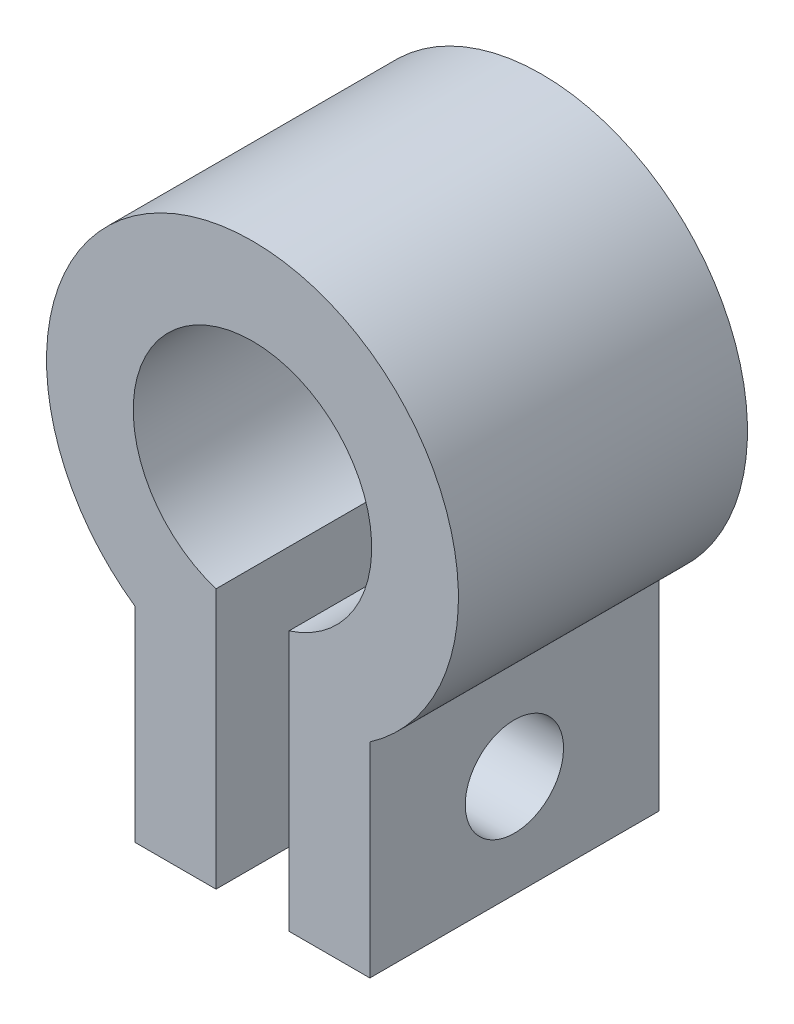
ISO-10303-21;
HEADER;
FILE_DESCRIPTION(('STEP AP214'),'2;1');
FILE_NAME('part.step','',(''),(''),'','','');
FILE_SCHEMA(('AUTOMOTIVE_DESIGN { 1 0 10303 214 1 1 1 1 }'));
ENDSEC;
DATA;
#1=APPLICATION_CONTEXT('core data for automotive mechanical design processes');
#2=APPLICATION_PROTOCOL_DEFINITION('international standard','automotive_design',2000,#1);
#3=PRODUCT_CONTEXT('',#1,'mechanical');
#4=PRODUCT('Part','Part','',(#3));
#5=PRODUCT_RELATED_PRODUCT_CATEGORY('part','',(#4));
#6=PRODUCT_DEFINITION_FORMATION('','',#4);
#7=PRODUCT_DEFINITION_CONTEXT('part definition',#1,'design');
#8=PRODUCT_DEFINITION('design','',#6,#7);
#9=PRODUCT_DEFINITION_SHAPE('','',#8);
#10=(LENGTH_UNIT() NAMED_UNIT(*) SI_UNIT(.MILLI.,.METRE.));
#11=(NAMED_UNIT(*) PLANE_ANGLE_UNIT() SI_UNIT($,.RADIAN.));
#12=(NAMED_UNIT(*) SI_UNIT($,.STERADIAN.) SOLID_ANGLE_UNIT());
#13=UNCERTAINTY_MEASURE_WITH_UNIT(LENGTH_MEASURE(1.E-05),#10,'distance_accuracy_value','');
#14=(GEOMETRIC_REPRESENTATION_CONTEXT(3) GLOBAL_UNCERTAINTY_ASSIGNED_CONTEXT((#13)) GLOBAL_UNIT_ASSIGNED_CONTEXT((#10,
#11,#12)) REPRESENTATION_CONTEXT('',''));
#15=CARTESIAN_POINT('',(0.,0.,0.));
#16=DIRECTION('',(0.,0.,1.));
#17=DIRECTION('',(1.,0.,0.));
#18=AXIS2_PLACEMENT_3D('',#15,#16,#17);
#19=CARTESIAN_POINT('',(1.26124537025839,0.,10.));
#20=DIRECTION('',(1.,0.,0.));
#21=DIRECTION('',(0.,1.,0.));
#22=AXIS2_PLACEMENT_3D('',#19,#20,#21);
#23=PLANE('',#22);
#24=CARTESIAN_POINT('',(1.26124537025839,-9.3908371971767,5.));
#25=DIRECTION('',(1.,0.,0.));
#26=DIRECTION('',(0.,1.,0.));
#27=AXIS2_PLACEMENT_3D('',#24,#25,#26);
#28=CIRCLE('',#27,1.7);
#29=CARTESIAN_POINT('',(1.26124537025839,-7.6908371971767,5.));
#30=VERTEX_POINT('',#29);
#31=EDGE_CURVE('E135',#30,#30,#28,.T.);
#32=ORIENTED_EDGE('',*,*,#31,.T.);
#33=EDGE_LOOP('',(#32));
#34=FACE_BOUND('',#33,.T.);
#35=DIRECTION('',(0.,-1.,0.));
#36=VECTOR('',#35,1.);
#37=CARTESIAN_POINT('',(1.26124537025839,0.,0.));
#38=LINE('',#37,#36);
#39=CARTESIAN_POINT('',(1.26124537025839,-3.92745275159381,0.));
#40=VERTEX_POINT('',#39);
#41=CARTESIAN_POINT('',(1.26124537025839,-12.9274527515938,0.));
#42=VERTEX_POINT('',#41);
#43=EDGE_CURVE('E132',#40,#42,#38,.T.);
#44=ORIENTED_EDGE('',*,*,#43,.T.);
#45=DIRECTION('',(0.,0.,-1.));
#46=VECTOR('',#45,1.);
#47=CARTESIAN_POINT('',(1.26124537025839,-12.9274527515938,10.));
#48=LINE('',#47,#46);
#49=CARTESIAN_POINT('',(1.26124537025839,-12.9274527515938,10.));
#50=VERTEX_POINT('',#49);
#51=EDGE_CURVE('E11',#50,#42,#48,.T.);
#52=ORIENTED_EDGE('',*,*,#51,.F.);
#53=DIRECTION('',(0.,-1.,0.));
#54=VECTOR('',#53,1.);
#55=CARTESIAN_POINT('',(1.26124537025839,0.,10.));
#56=LINE('',#55,#54);
#57=CARTESIAN_POINT('',(1.26124537025839,-3.92745275159381,10.));
#58=VERTEX_POINT('',#57);
#59=EDGE_CURVE('E152',#58,#50,#56,.T.);
#60=ORIENTED_EDGE('',*,*,#59,.F.);
#61=DIRECTION('',(0.,0.,-1.));
#62=VECTOR('',#61,1.);
#63=CARTESIAN_POINT('',(1.26124537025839,-3.92745275159381,10.));
#64=LINE('',#63,#62);
#65=EDGE_CURVE('E52',#58,#40,#64,.T.);
#66=ORIENTED_EDGE('',*,*,#65,.T.);
#67=EDGE_LOOP('',(#44,#52,#60,#66));
#68=FACE_BOUND('',#67,.T.);
#69=ADVANCED_FACE('F35',(#34,#68),#23,.F.);
#70=CARTESIAN_POINT('',(0.,-12.9274527515938,10.));
#71=DIRECTION('',(0.,1.,0.));
#72=DIRECTION('',(0.,0.,1.));
#73=AXIS2_PLACEMENT_3D('',#70,#71,#72);
#74=PLANE('',#73);
#75=DIRECTION('',(1.,0.,0.));
#76=VECTOR('',#75,1.);
#77=CARTESIAN_POINT('',(0.,-12.9274527515938,0.));
#78=LINE('',#77,#76);
#79=CARTESIAN_POINT('',(4.06124537025839,-12.9274527515938,0.));
#80=VERTEX_POINT('',#79);
#81=EDGE_CURVE('E134',#42,#80,#78,.T.);
#82=ORIENTED_EDGE('',*,*,#81,.T.);
#83=DIRECTION('',(0.,0.,-1.));
#84=VECTOR('',#83,1.);
#85=CARTESIAN_POINT('',(4.06124537025839,-12.9274527515938,10.));
#86=LINE('',#85,#84);
#87=CARTESIAN_POINT('',(4.06124537025839,-12.9274527515938,10.));
#88=VERTEX_POINT('',#87);
#89=EDGE_CURVE('E44',#88,#80,#86,.T.);
#90=ORIENTED_EDGE('',*,*,#89,.F.);
#91=DIRECTION('',(1.,0.,0.));
#92=VECTOR('',#91,1.);
#93=CARTESIAN_POINT('',(0.,-12.9274527515938,10.));
#94=LINE('',#93,#92);
#95=EDGE_CURVE('E90',#50,#88,#94,.T.);
#96=ORIENTED_EDGE('',*,*,#95,.F.);
#97=ORIENTED_EDGE('',*,*,#51,.T.);
#98=EDGE_LOOP('',(#82,#90,#96,#97));
#99=FACE_BOUND('',#98,.T.);
#100=ADVANCED_FACE('F167',(#99),#74,.F.);
#101=CARTESIAN_POINT('',(4.06124537025839,0.,10.));
#102=DIRECTION('',(1.,0.,0.));
#103=DIRECTION('',(0.,1.,0.));
#104=AXIS2_PLACEMENT_3D('',#101,#102,#103);
#105=PLANE('',#104);
#106=CARTESIAN_POINT('',(4.06124537025839,-9.3908371971767,5.));
#107=DIRECTION('',(1.,0.,0.));
#108=DIRECTION('',(0.,1.,0.));
#109=AXIS2_PLACEMENT_3D('',#106,#107,#108);
#110=CIRCLE('',#109,1.7);
#111=CARTESIAN_POINT('',(4.06124537025839,-7.6908371971767,5.));
#112=VERTEX_POINT('',#111);
#113=EDGE_CURVE('E187',#112,#112,#110,.T.);
#114=ORIENTED_EDGE('',*,*,#113,.F.);
#115=EDGE_LOOP('',(#114));
#116=FACE_BOUND('',#115,.T.);
#117=DIRECTION('',(0.,-1.,0.));
#118=VECTOR('',#117,1.);
#119=CARTESIAN_POINT('',(4.06124537025839,0.,0.));
#120=LINE('',#119,#118);
#121=CARTESIAN_POINT('',(4.06124537025839,-5.85422164275959,0.));
#122=VERTEX_POINT('',#121);
#123=EDGE_CURVE('E138',#122,#80,#120,.T.);
#124=ORIENTED_EDGE('',*,*,#123,.F.);
#125=DIRECTION('',(0.,0.,-1.));
#126=VECTOR('',#125,1.);
#127=CARTESIAN_POINT('',(4.06124537025839,-5.85422164275959,10.));
#128=LINE('',#127,#126);
#129=CARTESIAN_POINT('',(4.06124537025839,-5.85422164275959,10.));
#130=VERTEX_POINT('',#129);
#131=EDGE_CURVE('E159',#130,#122,#128,.T.);
#132=ORIENTED_EDGE('',*,*,#131,.F.);
#133=DIRECTION('',(0.,-1.,0.));
#134=VECTOR('',#133,1.);
#135=CARTESIAN_POINT('',(4.06124537025839,0.,10.));
#136=LINE('',#135,#134);
#137=EDGE_CURVE('E166',#130,#88,#136,.T.);
#138=ORIENTED_EDGE('',*,*,#137,.T.);
#139=ORIENTED_EDGE('',*,*,#89,.T.);
#140=EDGE_LOOP('',(#124,#132,#138,#139));
#141=FACE_BOUND('',#140,.T.);
#142=ADVANCED_FACE('F164',(#116,#141),#105,.T.);
#143=CARTESIAN_POINT('',(0.,0.,10.));
#144=DIRECTION('',(0.,0.,-1.));
#145=DIRECTION('',(-1.,0.,0.));
#146=AXIS2_PLACEMENT_3D('',#143,#144,#145);
#147=CYLINDRICAL_SURFACE('',#146,7.125);
#148=CARTESIAN_POINT('',(0.,0.,0.));
#149=DIRECTION('',(0.,0.,1.));
#150=DIRECTION('',(1.,0.,0.));
#151=AXIS2_PLACEMENT_3D('',#148,#149,#150);
#152=CIRCLE('',#151,7.125);
#153=CARTESIAN_POINT('',(-4.06124537025839,-5.85422164275959,0.));
#154=VERTEX_POINT('',#153);
#155=EDGE_CURVE('E141',#122,#154,#152,.T.);
#156=ORIENTED_EDGE('',*,*,#155,.T.);
#157=DIRECTION('',(0.,0.,-1.));
#158=VECTOR('',#157,1.);
#159=CARTESIAN_POINT('',(-4.06124537025839,-5.85422164275959,10.));
#160=LINE('',#159,#158);
#161=CARTESIAN_POINT('',(-4.06124537025839,-5.85422164275959,10.));
#162=VERTEX_POINT('',#161);
#163=EDGE_CURVE('E156',#162,#154,#160,.T.);
#164=ORIENTED_EDGE('',*,*,#163,.F.);
#165=CARTESIAN_POINT('',(0.,0.,10.));
#166=DIRECTION('',(0.,0.,1.));
#167=DIRECTION('',(1.,0.,0.));
#168=AXIS2_PLACEMENT_3D('',#165,#166,#167);
#169=CIRCLE('',#168,7.125);
#170=EDGE_CURVE('E179',#130,#162,#169,.T.);
#171=ORIENTED_EDGE('',*,*,#170,.F.);
#172=ORIENTED_EDGE('',*,*,#131,.T.);
#173=EDGE_LOOP('',(#156,#164,#171,#172));
#174=FACE_BOUND('',#173,.T.);
#175=ADVANCED_FACE('F175',(#174),#147,.T.);
#176=CARTESIAN_POINT('',(-4.06124537025839,0.,10.));
#177=DIRECTION('',(1.,0.,0.));
#178=DIRECTION('',(0.,1.,0.));
#179=AXIS2_PLACEMENT_3D('',#176,#177,#178);
#180=PLANE('',#179);
#181=CARTESIAN_POINT('',(-4.06124537025839,-9.3908371971767,5.));
#182=DIRECTION('',(-1.,0.,0.));
#183=DIRECTION('',(0.,-1.,0.));
#184=AXIS2_PLACEMENT_3D('',#181,#182,#183);
#185=CIRCLE('',#184,1.7);
#186=CARTESIAN_POINT('',(-4.06124537025839,-11.0908371971767,5.));
#187=VERTEX_POINT('',#186);
#188=EDGE_CURVE('E190',#187,#187,#185,.T.);
#189=ORIENTED_EDGE('',*,*,#188,.F.);
#190=EDGE_LOOP('',(#189));
#191=FACE_BOUND('',#190,.T.);
#192=DIRECTION('',(0.,-1.,0.));
#193=VECTOR('',#192,1.);
#194=CARTESIAN_POINT('',(-4.06124537025839,0.,0.));
#195=LINE('',#194,#193);
#196=CARTESIAN_POINT('',(-4.06124537025839,-12.9274527515938,0.));
#197=VERTEX_POINT('',#196);
#198=EDGE_CURVE('E143',#154,#197,#195,.T.);
#199=ORIENTED_EDGE('',*,*,#198,.T.);
#200=DIRECTION('',(0.,0.,-1.));
#201=VECTOR('',#200,1.);
#202=CARTESIAN_POINT('',(-4.06124537025839,-12.9274527515938,10.));
#203=LINE('',#202,#201);
#204=CARTESIAN_POINT('',(-4.06124537025839,-12.9274527515938,10.));
#205=VERTEX_POINT('',#204);
#206=EDGE_CURVE('E115',#205,#197,#203,.T.);
#207=ORIENTED_EDGE('',*,*,#206,.F.);
#208=DIRECTION('',(0.,-1.,0.));
#209=VECTOR('',#208,1.);
#210=CARTESIAN_POINT('',(-4.06124537025839,0.,10.));
#211=LINE('',#210,#209);
#212=EDGE_CURVE('E123',#162,#205,#211,.T.);
#213=ORIENTED_EDGE('',*,*,#212,.F.);
#214=ORIENTED_EDGE('',*,*,#163,.T.);
#215=EDGE_LOOP('',(#199,#207,#213,#214));
#216=FACE_BOUND('',#215,.T.);
#217=ADVANCED_FACE('F178',(#191,#216),#180,.F.);
#218=CARTESIAN_POINT('',(0.,-12.9274527515938,10.));
#219=DIRECTION('',(0.,-1.,0.));
#220=DIRECTION('',(0.,0.,-1.));
#221=AXIS2_PLACEMENT_3D('',#218,#219,#220);
#222=PLANE('',#221);
#223=DIRECTION('',(-1.,0.,0.));
#224=VECTOR('',#223,1.);
#225=CARTESIAN_POINT('',(0.,-12.9274527515938,0.));
#226=LINE('',#225,#224);
#227=CARTESIAN_POINT('',(-1.26124537025839,-12.9274527515938,0.));
#228=VERTEX_POINT('',#227);
#229=EDGE_CURVE('E111',#228,#197,#226,.T.);
#230=ORIENTED_EDGE('',*,*,#229,.F.);
#231=DIRECTION('',(0.,0.,-1.));
#232=VECTOR('',#231,1.);
#233=CARTESIAN_POINT('',(-1.26124537025839,-12.9274527515938,10.));
#234=LINE('',#233,#232);
#235=CARTESIAN_POINT('',(-1.26124537025839,-12.9274527515938,10.));
#236=VERTEX_POINT('',#235);
#237=EDGE_CURVE('E106',#236,#228,#234,.T.);
#238=ORIENTED_EDGE('',*,*,#237,.F.);
#239=DIRECTION('',(-1.,0.,0.));
#240=VECTOR('',#239,1.);
#241=CARTESIAN_POINT('',(0.,-12.9274527515938,10.));
#242=LINE('',#241,#240);
#243=EDGE_CURVE('E109',#236,#205,#242,.T.);
#244=ORIENTED_EDGE('',*,*,#243,.T.);
#245=ORIENTED_EDGE('',*,*,#206,.T.);
#246=EDGE_LOOP('',(#230,#238,#244,#245));
#247=FACE_BOUND('',#246,.T.);
#248=ADVANCED_FACE('F108',(#247),#222,.T.);
#249=CARTESIAN_POINT('',(-1.26124537025839,0.,10.));
#250=DIRECTION('',(1.,0.,0.));
#251=DIRECTION('',(0.,1.,0.));
#252=AXIS2_PLACEMENT_3D('',#249,#250,#251);
#253=PLANE('',#252);
#254=CARTESIAN_POINT('',(-1.26124537025839,-9.3908371971767,5.));
#255=DIRECTION('',(1.,0.,0.));
#256=DIRECTION('',(0.,1.,0.));
#257=AXIS2_PLACEMENT_3D('',#254,#255,#256);
#258=CIRCLE('',#257,1.7);
#259=CARTESIAN_POINT('',(-1.26124537025839,-7.6908371971767,5.));
#260=VERTEX_POINT('',#259);
#261=EDGE_CURVE('E38',#260,#260,#258,.T.);
#262=ORIENTED_EDGE('',*,*,#261,.F.);
#263=EDGE_LOOP('',(#262));
#264=FACE_BOUND('',#263,.T.);
#265=DIRECTION('',(0.,-1.,0.));
#266=VECTOR('',#265,1.);
#267=CARTESIAN_POINT('',(-1.26124537025839,0.,0.));
#268=LINE('',#267,#266);
#269=CARTESIAN_POINT('',(-1.26124537025839,-3.92745275159381,0.));
#270=VERTEX_POINT('',#269);
#271=EDGE_CURVE('E147',#270,#228,#268,.T.);
#272=ORIENTED_EDGE('',*,*,#271,.F.);
#273=DIRECTION('',(0.,0.,-1.));
#274=VECTOR('',#273,1.);
#275=CARTESIAN_POINT('',(-1.26124537025839,-3.92745275159381,10.));
#276=LINE('',#275,#274);
#277=CARTESIAN_POINT('',(-1.26124537025839,-3.92745275159381,10.));
#278=VERTEX_POINT('',#277);
#279=EDGE_CURVE('E78',#278,#270,#276,.T.);
#280=ORIENTED_EDGE('',*,*,#279,.F.);
#281=DIRECTION('',(0.,-1.,0.));
#282=VECTOR('',#281,1.);
#283=CARTESIAN_POINT('',(-1.26124537025839,0.,10.));
#284=LINE('',#283,#282);
#285=EDGE_CURVE('E121',#278,#236,#284,.T.);
#286=ORIENTED_EDGE('',*,*,#285,.T.);
#287=ORIENTED_EDGE('',*,*,#237,.T.);
#288=EDGE_LOOP('',(#272,#280,#286,#287));
#289=FACE_BOUND('',#288,.T.);
#290=ADVANCED_FACE('F126',(#264,#289),#253,.T.);
#291=CARTESIAN_POINT('',(0.,0.,10.));
#292=DIRECTION('',(0.,0.,-1.));
#293=DIRECTION('',(-1.,0.,0.));
#294=AXIS2_PLACEMENT_3D('',#291,#292,#293);
#295=CYLINDRICAL_SURFACE('',#294,4.125);
#296=CARTESIAN_POINT('',(0.,0.,0.));
#297=DIRECTION('',(0.,0.,1.));
#298=DIRECTION('',(1.,0.,0.));
#299=AXIS2_PLACEMENT_3D('',#296,#297,#298);
#300=CIRCLE('',#299,4.125);
#301=EDGE_CURVE('E149',#40,#270,#300,.T.);
#302=ORIENTED_EDGE('',*,*,#301,.F.);
#303=ORIENTED_EDGE('',*,*,#65,.F.);
#304=CARTESIAN_POINT('',(0.,0.,10.));
#305=DIRECTION('',(0.,0.,1.));
#306=DIRECTION('',(1.,0.,0.));
#307=AXIS2_PLACEMENT_3D('',#304,#305,#306);
#308=CIRCLE('',#307,4.125);
#309=EDGE_CURVE('E127',#58,#278,#308,.T.);
#310=ORIENTED_EDGE('',*,*,#309,.T.);
#311=ORIENTED_EDGE('',*,*,#279,.T.);
#312=EDGE_LOOP('',(#302,#303,#310,#311));
#313=FACE_BOUND('',#312,.T.);
#314=ADVANCED_FACE('F200',(#313),#295,.F.);
#315=CARTESIAN_POINT('',(0.,0.,10.));
#316=DIRECTION('',(0.,0.,1.));
#317=DIRECTION('',(1.,0.,0.));
#318=AXIS2_PLACEMENT_3D('',#315,#316,#317);
#319=PLANE('',#318);
#320=ORIENTED_EDGE('',*,*,#59,.T.);
#321=ORIENTED_EDGE('',*,*,#95,.T.);
#322=ORIENTED_EDGE('',*,*,#137,.F.);
#323=ORIENTED_EDGE('',*,*,#170,.T.);
#324=ORIENTED_EDGE('',*,*,#212,.T.);
#325=ORIENTED_EDGE('',*,*,#243,.F.);
#326=ORIENTED_EDGE('',*,*,#285,.F.);
#327=ORIENTED_EDGE('',*,*,#309,.F.);
#328=EDGE_LOOP('',(#320,#321,#322,#323,#324,#325,#326,#327));
#329=FACE_BOUND('',#328,.T.);
#330=ADVANCED_FACE('F119',(#329),#319,.T.);
#331=CARTESIAN_POINT('',(0.,0.,0.));
#332=DIRECTION('',(0.,0.,1.));
#333=DIRECTION('',(1.,0.,0.));
#334=AXIS2_PLACEMENT_3D('',#331,#332,#333);
#335=PLANE('',#334);
#336=ORIENTED_EDGE('',*,*,#43,.F.);
#337=ORIENTED_EDGE('',*,*,#301,.T.);
#338=ORIENTED_EDGE('',*,*,#271,.T.);
#339=ORIENTED_EDGE('',*,*,#229,.T.);
#340=ORIENTED_EDGE('',*,*,#198,.F.);
#341=ORIENTED_EDGE('',*,*,#155,.F.);
#342=ORIENTED_EDGE('',*,*,#123,.T.);
#343=ORIENTED_EDGE('',*,*,#81,.F.);
#344=EDGE_LOOP('',(#336,#337,#338,#339,#340,#341,#342,#343));
#345=FACE_BOUND('',#344,.T.);
#346=ADVANCED_FACE('F171',(#345),#335,.F.);
#347=CARTESIAN_POINT('',(7.125,-9.3908371971767,5.));
#348=DIRECTION('',(-1.,0.,0.));
#349=DIRECTION('',(0.,-1.,0.));
#350=AXIS2_PLACEMENT_3D('',#347,#348,#349);
#351=CYLINDRICAL_SURFACE('',#350,1.7);
#352=ORIENTED_EDGE('',*,*,#261,.T.);
#353=EDGE_LOOP('',(#352));
#354=FACE_BOUND('',#353,.T.);
#355=ORIENTED_EDGE('',*,*,#188,.T.);
#356=EDGE_LOOP('',(#355));
#357=FACE_BOUND('',#356,.T.);
#358=ADVANCED_FACE('F197',(#354,#357),#351,.F.);
#359=ORIENTED_EDGE('',*,*,#113,.T.);
#360=EDGE_LOOP('',(#359));
#361=FACE_BOUND('',#360,.T.);
#362=ORIENTED_EDGE('',*,*,#31,.F.);
#363=EDGE_LOOP('',(#362));
#364=FACE_BOUND('',#363,.T.);
#365=ADVANCED_FACE('F215',(#361,#364),#351,.F.);
#366=CLOSED_SHELL('',(#69,#100,#142,#175,#217,#248,#290,#314,#330,#346,#358,#365));
#367=MANIFOLD_SOLID_BREP('B2',#366);
#368=ADVANCED_BREP_SHAPE_REPRESENTATION('',(#18,#367),#14);
#369=SHAPE_DEFINITION_REPRESENTATION(#9,#368);
ENDSEC;
END-ISO-10303-21;
